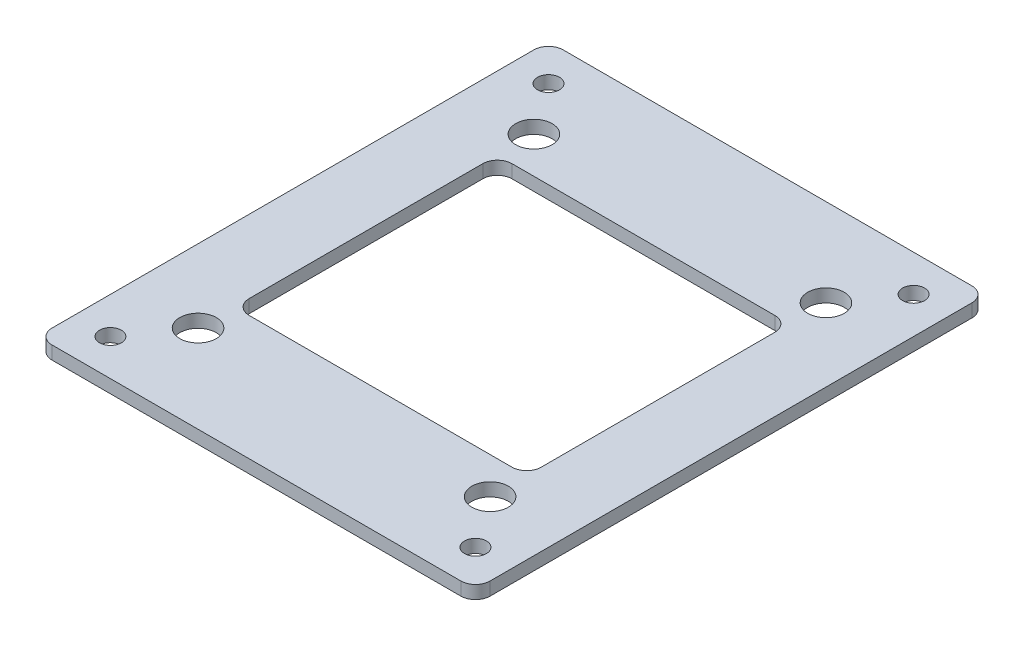
ISO-10303-21;
HEADER;
FILE_DESCRIPTION(('STEP AP214'),'2;1');
FILE_NAME('part.step','',(''),(''),'','','');
FILE_SCHEMA(('AUTOMOTIVE_DESIGN { 1 0 10303 214 1 1 1 1 }'));
ENDSEC;
DATA;
#1=APPLICATION_CONTEXT('core data for automotive mechanical design processes');
#2=APPLICATION_PROTOCOL_DEFINITION('international standard','automotive_design',2000,#1);
#3=PRODUCT_CONTEXT('',#1,'mechanical');
#4=PRODUCT('Part','Part','',(#3));
#5=PRODUCT_RELATED_PRODUCT_CATEGORY('part','',(#4));
#6=PRODUCT_DEFINITION_FORMATION('','',#4);
#7=PRODUCT_DEFINITION_CONTEXT('part definition',#1,'design');
#8=PRODUCT_DEFINITION('design','',#6,#7);
#9=PRODUCT_DEFINITION_SHAPE('','',#8);
#10=(LENGTH_UNIT() NAMED_UNIT(*) SI_UNIT(.MILLI.,.METRE.));
#11=(NAMED_UNIT(*) PLANE_ANGLE_UNIT() SI_UNIT($,.RADIAN.));
#12=(NAMED_UNIT(*) SI_UNIT($,.STERADIAN.) SOLID_ANGLE_UNIT());
#13=UNCERTAINTY_MEASURE_WITH_UNIT(LENGTH_MEASURE(1.E-05),#10,'distance_accuracy_value','');
#14=(GEOMETRIC_REPRESENTATION_CONTEXT(3) GLOBAL_UNCERTAINTY_ASSIGNED_CONTEXT((#13)) GLOBAL_UNIT_ASSIGNED_CONTEXT((#10,
#11,#12)) REPRESENTATION_CONTEXT('',''));
#15=CARTESIAN_POINT('',(0.,0.,0.));
#16=DIRECTION('',(0.,0.,1.));
#17=DIRECTION('',(1.,0.,0.));
#18=AXIS2_PLACEMENT_3D('',#15,#16,#17);
#19=CARTESIAN_POINT('',(0.,1.8,0.));
#20=DIRECTION('',(0.,-1.,0.));
#21=DIRECTION('',(0.,0.,-1.));
#22=AXIS2_PLACEMENT_3D('',#19,#20,#21);
#23=PLANE('',#22);
#24=DIRECTION('',(-1.,0.,0.));
#25=VECTOR('',#24,1.);
#26=CARTESIAN_POINT('',(-20.,1.8,-18.));
#27=LINE('',#26,#25);
#28=CARTESIAN_POINT('',(18.,1.8,-18.));
#29=VERTEX_POINT('',#28);
#30=CARTESIAN_POINT('',(-18.,1.8,-18.));
#31=VERTEX_POINT('',#30);
#32=EDGE_CURVE('E172',#29,#31,#27,.T.);
#33=ORIENTED_EDGE('',*,*,#32,.F.);
#34=CARTESIAN_POINT('',(18.,1.8,-16.));
#35=DIRECTION('',(0.,-1.,0.));
#36=DIRECTION('',(0.,0.,-1.));
#37=AXIS2_PLACEMENT_3D('',#34,#35,#36);
#38=CIRCLE('',#37,2.);
#39=CARTESIAN_POINT('',(20.,1.8,-16.));
#40=VERTEX_POINT('',#39);
#41=EDGE_CURVE('E154',#29,#40,#38,.T.);
#42=ORIENTED_EDGE('',*,*,#41,.T.);
#43=DIRECTION('',(0.,0.,-1.));
#44=VECTOR('',#43,1.);
#45=CARTESIAN_POINT('',(20.,1.8,18.));
#46=LINE('',#45,#44);
#47=CARTESIAN_POINT('',(20.,1.8,16.));
#48=VERTEX_POINT('',#47);
#49=EDGE_CURVE('E185',#48,#40,#46,.T.);
#50=ORIENTED_EDGE('',*,*,#49,.F.);
#51=CARTESIAN_POINT('',(18.,1.8,16.));
#52=DIRECTION('',(0.,-1.,0.));
#53=DIRECTION('',(0.,0.,-1.));
#54=AXIS2_PLACEMENT_3D('',#51,#52,#53);
#55=CIRCLE('',#54,2.);
#56=CARTESIAN_POINT('',(18.,1.8,18.));
#57=VERTEX_POINT('',#56);
#58=EDGE_CURVE('E346',#48,#57,#55,.T.);
#59=ORIENTED_EDGE('',*,*,#58,.T.);
#60=DIRECTION('',(1.,0.,0.));
#61=VECTOR('',#60,1.);
#62=CARTESIAN_POINT('',(-20.,1.8,18.));
#63=LINE('',#62,#61);
#64=CARTESIAN_POINT('',(-18.,1.8,18.));
#65=VERTEX_POINT('',#64);
#66=EDGE_CURVE('E190',#65,#57,#63,.T.);
#67=ORIENTED_EDGE('',*,*,#66,.F.);
#68=CARTESIAN_POINT('',(-18.,1.8,16.));
#69=DIRECTION('',(0.,-1.,0.));
#70=DIRECTION('',(0.,0.,-1.));
#71=AXIS2_PLACEMENT_3D('',#68,#69,#70);
#72=CIRCLE('',#71,2.);
#73=CARTESIAN_POINT('',(-20.,1.8,16.));
#74=VERTEX_POINT('',#73);
#75=EDGE_CURVE('E48',#65,#74,#72,.T.);
#76=ORIENTED_EDGE('',*,*,#75,.T.);
#77=DIRECTION('',(0.,0.,1.));
#78=VECTOR('',#77,1.);
#79=CARTESIAN_POINT('',(-20.,1.8,18.));
#80=LINE('',#79,#78);
#81=CARTESIAN_POINT('',(-20.,1.8,-16.));
#82=VERTEX_POINT('',#81);
#83=EDGE_CURVE('E184',#82,#74,#80,.T.);
#84=ORIENTED_EDGE('',*,*,#83,.F.);
#85=CARTESIAN_POINT('',(-18.,1.8,-16.));
#86=DIRECTION('',(0.,-1.,0.));
#87=DIRECTION('',(0.,0.,-1.));
#88=AXIS2_PLACEMENT_3D('',#85,#86,#87);
#89=CIRCLE('',#88,2.);
#90=EDGE_CURVE('E182',#82,#31,#89,.T.);
#91=ORIENTED_EDGE('',*,*,#90,.T.);
#92=EDGE_LOOP('',(#33,#42,#50,#59,#67,#76,#84,#91));
#93=FACE_BOUND('',#92,.T.);
#94=CARTESIAN_POINT('',(-25.,1.8,30.));
#95=DIRECTION('',(0.,1.,0.));
#96=DIRECTION('',(0.,0.,-1.));
#97=AXIS2_PLACEMENT_3D('',#94,#95,#96);
#98=CIRCLE('',#97,1.5);
#99=CARTESIAN_POINT('',(-25.,1.8,28.5));
#100=VERTEX_POINT('',#99);
#101=EDGE_CURVE('E375',#100,#100,#98,.T.);
#102=ORIENTED_EDGE('',*,*,#101,.F.);
#103=EDGE_LOOP('',(#102));
#104=FACE_BOUND('',#103,.T.);
#105=CARTESIAN_POINT('',(24.9999999999998,1.8,30.));
#106=DIRECTION('',(0.,1.,0.));
#107=DIRECTION('',(0.,0.,1.));
#108=AXIS2_PLACEMENT_3D('',#105,#106,#107);
#109=CIRCLE('',#108,1.50000000000001);
#110=CARTESIAN_POINT('',(24.9999999999998,1.8,31.5));
#111=VERTEX_POINT('',#110);
#112=EDGE_CURVE('E391',#111,#111,#109,.T.);
#113=ORIENTED_EDGE('',*,*,#112,.F.);
#114=EDGE_LOOP('',(#113));
#115=FACE_BOUND('',#114,.T.);
#116=CARTESIAN_POINT('',(24.9999999999998,1.8,-30.));
#117=DIRECTION('',(0.,1.,0.));
#118=DIRECTION('',(0.,0.,-1.));
#119=AXIS2_PLACEMENT_3D('',#116,#117,#118);
#120=CIRCLE('',#119,1.50000000000001);
#121=CARTESIAN_POINT('',(24.9999999999998,1.8,-31.5));
#122=VERTEX_POINT('',#121);
#123=EDGE_CURVE('E399',#122,#122,#120,.T.);
#124=ORIENTED_EDGE('',*,*,#123,.F.);
#125=EDGE_LOOP('',(#124));
#126=FACE_BOUND('',#125,.T.);
#127=CARTESIAN_POINT('',(-25.,1.8,-30.));
#128=DIRECTION('',(0.,1.,0.));
#129=DIRECTION('',(0.,0.,1.));
#130=AXIS2_PLACEMENT_3D('',#127,#128,#129);
#131=CIRCLE('',#130,1.5);
#132=CARTESIAN_POINT('',(-25.,1.8,-28.5));
#133=VERTEX_POINT('',#132);
#134=EDGE_CURVE('E204',#133,#133,#131,.T.);
#135=ORIENTED_EDGE('',*,*,#134,.F.);
#136=EDGE_LOOP('',(#135));
#137=FACE_BOUND('',#136,.T.);
#138=DIRECTION('',(0.,0.,1.));
#139=VECTOR('',#138,1.);
#140=CARTESIAN_POINT('',(-30.,1.8,35.));
#141=LINE('',#140,#139);
#142=CARTESIAN_POINT('',(-30.,1.8,-33.));
#143=VERTEX_POINT('',#142);
#144=CARTESIAN_POINT('',(-30.,1.8,33.));
#145=VERTEX_POINT('',#144);
#146=EDGE_CURVE('E248',#143,#145,#141,.T.);
#147=ORIENTED_EDGE('',*,*,#146,.T.);
#148=CARTESIAN_POINT('',(-28.,1.8,33.));
#149=DIRECTION('',(0.,-1.,0.));
#150=DIRECTION('',(0.,0.,-1.));
#151=AXIS2_PLACEMENT_3D('',#148,#149,#150);
#152=CIRCLE('',#151,2.);
#153=CARTESIAN_POINT('',(-28.,1.8,35.));
#154=VERTEX_POINT('',#153);
#155=EDGE_CURVE('E324',#145,#154,#152,.F.);
#156=ORIENTED_EDGE('',*,*,#155,.T.);
#157=DIRECTION('',(1.,0.,0.));
#158=VECTOR('',#157,1.);
#159=CARTESIAN_POINT('',(-30.,1.8,35.));
#160=LINE('',#159,#158);
#161=CARTESIAN_POINT('',(28.,1.8,35.));
#162=VERTEX_POINT('',#161);
#163=EDGE_CURVE('E252',#154,#162,#160,.T.);
#164=ORIENTED_EDGE('',*,*,#163,.T.);
#165=CARTESIAN_POINT('',(28.,1.8,33.));
#166=DIRECTION('',(0.,-1.,0.));
#167=DIRECTION('',(0.,0.,-1.));
#168=AXIS2_PLACEMENT_3D('',#165,#166,#167);
#169=CIRCLE('',#168,2.);
#170=CARTESIAN_POINT('',(30.,1.8,33.));
#171=VERTEX_POINT('',#170);
#172=EDGE_CURVE('E321',#162,#171,#169,.F.);
#173=ORIENTED_EDGE('',*,*,#172,.T.);
#174=DIRECTION('',(0.,0.,-1.));
#175=VECTOR('',#174,1.);
#176=CARTESIAN_POINT('',(30.,1.8,35.));
#177=LINE('',#176,#175);
#178=CARTESIAN_POINT('',(30.,1.8,-33.));
#179=VERTEX_POINT('',#178);
#180=EDGE_CURVE('E241',#171,#179,#177,.T.);
#181=ORIENTED_EDGE('',*,*,#180,.T.);
#182=CARTESIAN_POINT('',(28.,1.8,-33.));
#183=DIRECTION('',(0.,-1.,0.));
#184=DIRECTION('',(0.,0.,-1.));
#185=AXIS2_PLACEMENT_3D('',#182,#183,#184);
#186=CIRCLE('',#185,2.);
#187=CARTESIAN_POINT('',(28.,1.8,-35.));
#188=VERTEX_POINT('',#187);
#189=EDGE_CURVE('E62',#179,#188,#186,.F.);
#190=ORIENTED_EDGE('',*,*,#189,.T.);
#191=DIRECTION('',(-1.,0.,0.));
#192=VECTOR('',#191,1.);
#193=CARTESIAN_POINT('',(-30.,1.8,-35.));
#194=LINE('',#193,#192);
#195=CARTESIAN_POINT('',(-28.,1.8,-35.));
#196=VERTEX_POINT('',#195);
#197=EDGE_CURVE('E244',#188,#196,#194,.T.);
#198=ORIENTED_EDGE('',*,*,#197,.T.);
#199=CARTESIAN_POINT('',(-28.,1.8,-33.));
#200=DIRECTION('',(0.,-1.,0.));
#201=DIRECTION('',(0.,0.,-1.));
#202=AXIS2_PLACEMENT_3D('',#199,#200,#201);
#203=CIRCLE('',#202,2.);
#204=EDGE_CURVE('E316',#196,#143,#203,.F.);
#205=ORIENTED_EDGE('',*,*,#204,.T.);
#206=EDGE_LOOP('',(#147,#156,#164,#173,#181,#190,#198,#205));
#207=FACE_BOUND('',#206,.T.);
#208=CARTESIAN_POINT('',(-20.,1.8,-23.));
#209=DIRECTION('',(0.,1.,0.));
#210=DIRECTION('',(0.,0.,1.));
#211=AXIS2_PLACEMENT_3D('',#208,#209,#210);
#212=CIRCLE('',#211,2.5);
#213=CARTESIAN_POINT('',(-20.,1.8,-20.5));
#214=VERTEX_POINT('',#213);
#215=EDGE_CURVE('E233',#214,#214,#212,.T.);
#216=ORIENTED_EDGE('',*,*,#215,.F.);
#217=EDGE_LOOP('',(#216));
#218=FACE_BOUND('',#217,.T.);
#219=CARTESIAN_POINT('',(20.,1.8,-23.));
#220=DIRECTION('',(0.,1.,0.));
#221=DIRECTION('',(0.,0.,-1.));
#222=AXIS2_PLACEMENT_3D('',#219,#220,#221);
#223=CIRCLE('',#222,2.5);
#224=CARTESIAN_POINT('',(20.,1.8,-25.5));
#225=VERTEX_POINT('',#224);
#226=EDGE_CURVE('E225',#225,#225,#223,.T.);
#227=ORIENTED_EDGE('',*,*,#226,.F.);
#228=EDGE_LOOP('',(#227));
#229=FACE_BOUND('',#228,.T.);
#230=CARTESIAN_POINT('',(20.,1.8,23.));
#231=DIRECTION('',(0.,1.,0.));
#232=DIRECTION('',(0.,0.,1.));
#233=AXIS2_PLACEMENT_3D('',#230,#231,#232);
#234=CIRCLE('',#233,2.5);
#235=CARTESIAN_POINT('',(20.,1.8,25.5));
#236=VERTEX_POINT('',#235);
#237=EDGE_CURVE('E217',#236,#236,#234,.T.);
#238=ORIENTED_EDGE('',*,*,#237,.F.);
#239=EDGE_LOOP('',(#238));
#240=FACE_BOUND('',#239,.T.);
#241=CARTESIAN_POINT('',(-20.,1.8,23.));
#242=DIRECTION('',(0.,1.,0.));
#243=DIRECTION('',(0.,0.,-1.));
#244=AXIS2_PLACEMENT_3D('',#241,#242,#243);
#245=CIRCLE('',#244,2.5);
#246=CARTESIAN_POINT('',(-20.,1.8,20.5));
#247=VERTEX_POINT('',#246);
#248=EDGE_CURVE('E209',#247,#247,#245,.T.);
#249=ORIENTED_EDGE('',*,*,#248,.F.);
#250=EDGE_LOOP('',(#249));
#251=FACE_BOUND('',#250,.T.);
#252=ADVANCED_FACE('F39',(#93,#104,#115,#126,#137,#207,#218,#229,#240,#251),#23,.F.);
#253=CARTESIAN_POINT('',(0.,0.,0.));
#254=DIRECTION('',(0.,-1.,0.));
#255=DIRECTION('',(0.,0.,-1.));
#256=AXIS2_PLACEMENT_3D('',#253,#254,#255);
#257=PLANE('',#256);
#258=DIRECTION('',(1.,0.,0.));
#259=VECTOR('',#258,1.);
#260=CARTESIAN_POINT('',(-20.,0.,18.));
#261=LINE('',#260,#259);
#262=CARTESIAN_POINT('',(-18.,0.,18.));
#263=VERTEX_POINT('',#262);
#264=CARTESIAN_POINT('',(18.,0.,18.));
#265=VERTEX_POINT('',#264);
#266=EDGE_CURVE('E368',#263,#265,#261,.T.);
#267=ORIENTED_EDGE('',*,*,#266,.T.);
#268=CARTESIAN_POINT('',(18.,0.,16.));
#269=DIRECTION('',(0.,-1.,0.));
#270=DIRECTION('',(0.,0.,-1.));
#271=AXIS2_PLACEMENT_3D('',#268,#269,#270);
#272=CIRCLE('',#271,2.);
#273=CARTESIAN_POINT('',(20.,0.,16.));
#274=VERTEX_POINT('',#273);
#275=EDGE_CURVE('E349',#265,#274,#272,.F.);
#276=ORIENTED_EDGE('',*,*,#275,.T.);
#277=DIRECTION('',(0.,0.,-1.));
#278=VECTOR('',#277,1.);
#279=CARTESIAN_POINT('',(20.,0.,18.));
#280=LINE('',#279,#278);
#281=CARTESIAN_POINT('',(20.,0.,-16.));
#282=VERTEX_POINT('',#281);
#283=EDGE_CURVE('E198',#274,#282,#280,.T.);
#284=ORIENTED_EDGE('',*,*,#283,.T.);
#285=CARTESIAN_POINT('',(18.,0.,-16.));
#286=DIRECTION('',(0.,-1.,0.));
#287=DIRECTION('',(0.,0.,-1.));
#288=AXIS2_PLACEMENT_3D('',#285,#286,#287);
#289=CIRCLE('',#288,2.);
#290=CARTESIAN_POINT('',(18.,0.,-18.));
#291=VERTEX_POINT('',#290);
#292=EDGE_CURVE('E165',#282,#291,#289,.F.);
#293=ORIENTED_EDGE('',*,*,#292,.T.);
#294=DIRECTION('',(-1.,0.,0.));
#295=VECTOR('',#294,1.);
#296=CARTESIAN_POINT('',(-20.,0.,-18.));
#297=LINE('',#296,#295);
#298=CARTESIAN_POINT('',(-18.,0.,-18.));
#299=VERTEX_POINT('',#298);
#300=EDGE_CURVE('E175',#291,#299,#297,.T.);
#301=ORIENTED_EDGE('',*,*,#300,.T.);
#302=CARTESIAN_POINT('',(-18.,0.,-16.));
#303=DIRECTION('',(0.,-1.,0.));
#304=DIRECTION('',(0.,0.,-1.));
#305=AXIS2_PLACEMENT_3D('',#302,#303,#304);
#306=CIRCLE('',#305,2.);
#307=CARTESIAN_POINT('',(-20.,0.,-16.));
#308=VERTEX_POINT('',#307);
#309=EDGE_CURVE('E343',#299,#308,#306,.F.);
#310=ORIENTED_EDGE('',*,*,#309,.T.);
#311=DIRECTION('',(0.,0.,1.));
#312=VECTOR('',#311,1.);
#313=CARTESIAN_POINT('',(-20.,0.,18.));
#314=LINE('',#313,#312);
#315=CARTESIAN_POINT('',(-20.,0.,16.));
#316=VERTEX_POINT('',#315);
#317=EDGE_CURVE('E370',#308,#316,#314,.T.);
#318=ORIENTED_EDGE('',*,*,#317,.T.);
#319=CARTESIAN_POINT('',(-18.,0.,16.));
#320=DIRECTION('',(0.,-1.,0.));
#321=DIRECTION('',(0.,0.,-1.));
#322=AXIS2_PLACEMENT_3D('',#319,#320,#321);
#323=CIRCLE('',#322,2.);
#324=EDGE_CURVE('E11',#316,#263,#323,.F.);
#325=ORIENTED_EDGE('',*,*,#324,.T.);
#326=EDGE_LOOP('',(#267,#276,#284,#293,#301,#310,#318,#325));
#327=FACE_BOUND('',#326,.T.);
#328=CARTESIAN_POINT('',(-25.,0.,30.));
#329=DIRECTION('',(0.,1.,0.));
#330=DIRECTION('',(0.,0.,-1.));
#331=AXIS2_PLACEMENT_3D('',#328,#329,#330);
#332=CIRCLE('',#331,1.5);
#333=CARTESIAN_POINT('',(-25.,0.,28.5));
#334=VERTEX_POINT('',#333);
#335=EDGE_CURVE('E379',#334,#334,#332,.T.);
#336=ORIENTED_EDGE('',*,*,#335,.T.);
#337=EDGE_LOOP('',(#336));
#338=FACE_BOUND('',#337,.T.);
#339=CARTESIAN_POINT('',(24.9999999999998,0.,30.));
#340=DIRECTION('',(0.,1.,0.));
#341=DIRECTION('',(0.,0.,1.));
#342=AXIS2_PLACEMENT_3D('',#339,#340,#341);
#343=CIRCLE('',#342,1.50000000000001);
#344=CARTESIAN_POINT('',(24.9999999999998,0.,31.5));
#345=VERTEX_POINT('',#344);
#346=EDGE_CURVE('E395',#345,#345,#343,.T.);
#347=ORIENTED_EDGE('',*,*,#346,.T.);
#348=EDGE_LOOP('',(#347));
#349=FACE_BOUND('',#348,.T.);
#350=CARTESIAN_POINT('',(24.9999999999998,0.,-30.));
#351=DIRECTION('',(0.,1.,0.));
#352=DIRECTION('',(0.,0.,-1.));
#353=AXIS2_PLACEMENT_3D('',#350,#351,#352);
#354=CIRCLE('',#353,1.50000000000001);
#355=CARTESIAN_POINT('',(24.9999999999998,0.,-31.5));
#356=VERTEX_POINT('',#355);
#357=EDGE_CURVE('E208',#356,#356,#354,.T.);
#358=ORIENTED_EDGE('',*,*,#357,.T.);
#359=EDGE_LOOP('',(#358));
#360=FACE_BOUND('',#359,.T.);
#361=CARTESIAN_POINT('',(-25.,0.,-30.));
#362=DIRECTION('',(0.,1.,0.));
#363=DIRECTION('',(0.,0.,1.));
#364=AXIS2_PLACEMENT_3D('',#361,#362,#363);
#365=CIRCLE('',#364,1.5);
#366=CARTESIAN_POINT('',(-25.,0.,-28.5));
#367=VERTEX_POINT('',#366);
#368=EDGE_CURVE('E199',#367,#367,#365,.T.);
#369=ORIENTED_EDGE('',*,*,#368,.T.);
#370=EDGE_LOOP('',(#369));
#371=FACE_BOUND('',#370,.T.);
#372=CARTESIAN_POINT('',(20.,0.,23.));
#373=DIRECTION('',(0.,1.,0.));
#374=DIRECTION('',(0.,0.,1.));
#375=AXIS2_PLACEMENT_3D('',#372,#373,#374);
#376=CIRCLE('',#375,2.5);
#377=CARTESIAN_POINT('',(20.,0.,25.5));
#378=VERTEX_POINT('',#377);
#379=EDGE_CURVE('E213',#378,#378,#376,.T.);
#380=ORIENTED_EDGE('',*,*,#379,.T.);
#381=EDGE_LOOP('',(#380));
#382=FACE_BOUND('',#381,.T.);
#383=CARTESIAN_POINT('',(-20.,0.,-23.));
#384=DIRECTION('',(0.,1.,0.));
#385=DIRECTION('',(0.,0.,1.));
#386=AXIS2_PLACEMENT_3D('',#383,#384,#385);
#387=CIRCLE('',#386,2.5);
#388=CARTESIAN_POINT('',(-20.,0.,-20.5));
#389=VERTEX_POINT('',#388);
#390=EDGE_CURVE('E229',#389,#389,#387,.T.);
#391=ORIENTED_EDGE('',*,*,#390,.T.);
#392=EDGE_LOOP('',(#391));
#393=FACE_BOUND('',#392,.T.);
#394=DIRECTION('',(1.,0.,0.));
#395=VECTOR('',#394,1.);
#396=CARTESIAN_POINT('',(-30.,0.,35.));
#397=LINE('',#396,#395);
#398=CARTESIAN_POINT('',(-28.,0.,35.));
#399=VERTEX_POINT('',#398);
#400=CARTESIAN_POINT('',(28.,0.,35.));
#401=VERTEX_POINT('',#400);
#402=EDGE_CURVE('E245',#399,#401,#397,.T.);
#403=ORIENTED_EDGE('',*,*,#402,.F.);
#404=CARTESIAN_POINT('',(-28.,0.,33.));
#405=DIRECTION('',(0.,-1.,0.));
#406=DIRECTION('',(0.,0.,-1.));
#407=AXIS2_PLACEMENT_3D('',#404,#405,#406);
#408=CIRCLE('',#407,2.);
#409=CARTESIAN_POINT('',(-30.,0.,33.));
#410=VERTEX_POINT('',#409);
#411=EDGE_CURVE('E306',#399,#410,#408,.T.);
#412=ORIENTED_EDGE('',*,*,#411,.T.);
#413=DIRECTION('',(0.,0.,1.));
#414=VECTOR('',#413,1.);
#415=CARTESIAN_POINT('',(-30.,0.,35.));
#416=LINE('',#415,#414);
#417=CARTESIAN_POINT('',(-30.,0.,-33.));
#418=VERTEX_POINT('',#417);
#419=EDGE_CURVE('E262',#418,#410,#416,.T.);
#420=ORIENTED_EDGE('',*,*,#419,.F.);
#421=CARTESIAN_POINT('',(-28.,0.,-33.));
#422=DIRECTION('',(0.,-1.,0.));
#423=DIRECTION('',(0.,0.,-1.));
#424=AXIS2_PLACEMENT_3D('',#421,#422,#423);
#425=CIRCLE('',#424,2.);
#426=CARTESIAN_POINT('',(-28.,0.,-35.));
#427=VERTEX_POINT('',#426);
#428=EDGE_CURVE('E297',#418,#427,#425,.T.);
#429=ORIENTED_EDGE('',*,*,#428,.T.);
#430=DIRECTION('',(-1.,0.,0.));
#431=VECTOR('',#430,1.);
#432=CARTESIAN_POINT('',(-30.,0.,-35.));
#433=LINE('',#432,#431);
#434=CARTESIAN_POINT('',(28.,0.,-35.));
#435=VERTEX_POINT('',#434);
#436=EDGE_CURVE('E259',#435,#427,#433,.T.);
#437=ORIENTED_EDGE('',*,*,#436,.F.);
#438=CARTESIAN_POINT('',(28.,0.,-33.));
#439=DIRECTION('',(0.,-1.,0.));
#440=DIRECTION('',(0.,0.,-1.));
#441=AXIS2_PLACEMENT_3D('',#438,#439,#440);
#442=CIRCLE('',#441,2.);
#443=CARTESIAN_POINT('',(30.,0.,-33.));
#444=VERTEX_POINT('',#443);
#445=EDGE_CURVE('E300',#435,#444,#442,.T.);
#446=ORIENTED_EDGE('',*,*,#445,.T.);
#447=DIRECTION('',(0.,0.,-1.));
#448=VECTOR('',#447,1.);
#449=CARTESIAN_POINT('',(30.,0.,35.));
#450=LINE('',#449,#448);
#451=CARTESIAN_POINT('',(30.,0.,33.));
#452=VERTEX_POINT('',#451);
#453=EDGE_CURVE('E237',#452,#444,#450,.T.);
#454=ORIENTED_EDGE('',*,*,#453,.F.);
#455=CARTESIAN_POINT('',(28.,0.,33.));
#456=DIRECTION('',(0.,-1.,0.));
#457=DIRECTION('',(0.,0.,-1.));
#458=AXIS2_PLACEMENT_3D('',#455,#456,#457);
#459=CIRCLE('',#458,2.);
#460=EDGE_CURVE('E303',#452,#401,#459,.T.);
#461=ORIENTED_EDGE('',*,*,#460,.T.);
#462=EDGE_LOOP('',(#403,#412,#420,#429,#437,#446,#454,#461));
#463=FACE_BOUND('',#462,.T.);
#464=CARTESIAN_POINT('',(20.,0.,-23.));
#465=DIRECTION('',(0.,1.,0.));
#466=DIRECTION('',(0.,0.,-1.));
#467=AXIS2_PLACEMENT_3D('',#464,#465,#466);
#468=CIRCLE('',#467,2.5);
#469=CARTESIAN_POINT('',(20.,0.,-25.5));
#470=VERTEX_POINT('',#469);
#471=EDGE_CURVE('E221',#470,#470,#468,.T.);
#472=ORIENTED_EDGE('',*,*,#471,.T.);
#473=EDGE_LOOP('',(#472));
#474=FACE_BOUND('',#473,.T.);
#475=CARTESIAN_POINT('',(-20.,0.,23.));
#476=DIRECTION('',(0.,1.,0.));
#477=DIRECTION('',(0.,0.,-1.));
#478=AXIS2_PLACEMENT_3D('',#475,#476,#477);
#479=CIRCLE('',#478,2.5);
#480=CARTESIAN_POINT('',(-20.,0.,20.5));
#481=VERTEX_POINT('',#480);
#482=EDGE_CURVE('E203',#481,#481,#479,.T.);
#483=ORIENTED_EDGE('',*,*,#482,.T.);
#484=EDGE_LOOP('',(#483));
#485=FACE_BOUND('',#484,.T.);
#486=ADVANCED_FACE('F366',(#327,#338,#349,#360,#371,#382,#393,#463,#474,#485),#257,.T.);
#487=CARTESIAN_POINT('',(30.,1.8,35.));
#488=DIRECTION('',(-1.,0.,0.));
#489=DIRECTION('',(0.,0.,1.));
#490=AXIS2_PLACEMENT_3D('',#487,#488,#489);
#491=PLANE('',#490);
#492=ORIENTED_EDGE('',*,*,#180,.F.);
#493=DIRECTION('',(0.,-1.,0.));
#494=VECTOR('',#493,1.);
#495=CARTESIAN_POINT('',(30.,1.8,33.));
#496=LINE('',#495,#494);
#497=EDGE_CURVE('E330',#171,#452,#496,.T.);
#498=ORIENTED_EDGE('',*,*,#497,.T.);
#499=ORIENTED_EDGE('',*,*,#453,.T.);
#500=DIRECTION('',(0.,-1.,0.));
#501=VECTOR('',#500,1.);
#502=CARTESIAN_POINT('',(30.,1.8,-33.));
#503=LINE('',#502,#501);
#504=EDGE_CURVE('E327',#444,#179,#503,.F.);
#505=ORIENTED_EDGE('',*,*,#504,.T.);
#506=EDGE_LOOP('',(#492,#498,#499,#505));
#507=FACE_BOUND('',#506,.T.);
#508=ADVANCED_FACE('F440',(#507),#491,.F.);
#509=CARTESIAN_POINT('',(-30.,1.8,-35.));
#510=DIRECTION('',(0.,0.,1.));
#511=DIRECTION('',(1.,0.,0.));
#512=AXIS2_PLACEMENT_3D('',#509,#510,#511);
#513=PLANE('',#512);
#514=ORIENTED_EDGE('',*,*,#197,.F.);
#515=DIRECTION('',(0.,-1.,0.));
#516=VECTOR('',#515,1.);
#517=CARTESIAN_POINT('',(28.,1.8,-35.));
#518=LINE('',#517,#516);
#519=EDGE_CURVE('E166',#188,#435,#518,.T.);
#520=ORIENTED_EDGE('',*,*,#519,.T.);
#521=ORIENTED_EDGE('',*,*,#436,.T.);
#522=DIRECTION('',(0.,-1.,0.));
#523=VECTOR('',#522,1.);
#524=CARTESIAN_POINT('',(-28.,1.8,-35.));
#525=LINE('',#524,#523);
#526=EDGE_CURVE('E55',#427,#196,#525,.F.);
#527=ORIENTED_EDGE('',*,*,#526,.T.);
#528=EDGE_LOOP('',(#514,#520,#521,#527));
#529=FACE_BOUND('',#528,.T.);
#530=ADVANCED_FACE('F445',(#529),#513,.F.);
#531=CARTESIAN_POINT('',(-30.,1.8,35.));
#532=DIRECTION('',(1.,0.,0.));
#533=DIRECTION('',(0.,0.,-1.));
#534=AXIS2_PLACEMENT_3D('',#531,#532,#533);
#535=PLANE('',#534);
#536=ORIENTED_EDGE('',*,*,#419,.T.);
#537=DIRECTION('',(0.,-1.,0.));
#538=VECTOR('',#537,1.);
#539=CARTESIAN_POINT('',(-30.,1.8,33.));
#540=LINE('',#539,#538);
#541=EDGE_CURVE('E313',#410,#145,#540,.F.);
#542=ORIENTED_EDGE('',*,*,#541,.T.);
#543=ORIENTED_EDGE('',*,*,#146,.F.);
#544=DIRECTION('',(0.,-1.,0.));
#545=VECTOR('',#544,1.);
#546=CARTESIAN_POINT('',(-30.,1.8,-33.));
#547=LINE('',#546,#545);
#548=EDGE_CURVE('E309',#143,#418,#547,.T.);
#549=ORIENTED_EDGE('',*,*,#548,.T.);
#550=EDGE_LOOP('',(#536,#542,#543,#549));
#551=FACE_BOUND('',#550,.T.);
#552=ADVANCED_FACE('F454',(#551),#535,.F.);
#553=CARTESIAN_POINT('',(-30.,1.8,35.));
#554=DIRECTION('',(0.,0.,-1.));
#555=DIRECTION('',(-1.,0.,0.));
#556=AXIS2_PLACEMENT_3D('',#553,#554,#555);
#557=PLANE('',#556);
#558=ORIENTED_EDGE('',*,*,#163,.F.);
#559=DIRECTION('',(0.,-1.,0.));
#560=VECTOR('',#559,1.);
#561=CARTESIAN_POINT('',(-28.,1.8,35.));
#562=LINE('',#561,#560);
#563=EDGE_CURVE('E293',#154,#399,#562,.T.);
#564=ORIENTED_EDGE('',*,*,#563,.T.);
#565=ORIENTED_EDGE('',*,*,#402,.T.);
#566=DIRECTION('',(0.,-1.,0.));
#567=VECTOR('',#566,1.);
#568=CARTESIAN_POINT('',(28.,1.8,35.));
#569=LINE('',#568,#567);
#570=EDGE_CURVE('E290',#401,#162,#569,.F.);
#571=ORIENTED_EDGE('',*,*,#570,.T.);
#572=EDGE_LOOP('',(#558,#564,#565,#571));
#573=FACE_BOUND('',#572,.T.);
#574=ADVANCED_FACE('F450',(#573),#557,.F.);
#575=CARTESIAN_POINT('',(-20.,1.8,-23.));
#576=DIRECTION('',(0.,-1.,0.));
#577=DIRECTION('',(0.,0.,-1.));
#578=AXIS2_PLACEMENT_3D('',#575,#576,#577);
#579=CYLINDRICAL_SURFACE('',#578,2.5);
#580=ORIENTED_EDGE('',*,*,#215,.T.);
#581=EDGE_LOOP('',(#580));
#582=FACE_BOUND('',#581,.T.);
#583=ORIENTED_EDGE('',*,*,#390,.F.);
#584=EDGE_LOOP('',(#583));
#585=FACE_BOUND('',#584,.T.);
#586=ADVANCED_FACE('F453',(#582,#585),#579,.F.);
#587=CARTESIAN_POINT('',(20.,1.8,-23.));
#588=DIRECTION('',(0.,-1.,0.));
#589=DIRECTION('',(0.,0.,-1.));
#590=AXIS2_PLACEMENT_3D('',#587,#588,#589);
#591=CYLINDRICAL_SURFACE('',#590,2.5);
#592=ORIENTED_EDGE('',*,*,#226,.T.);
#593=EDGE_LOOP('',(#592));
#594=FACE_BOUND('',#593,.T.);
#595=ORIENTED_EDGE('',*,*,#471,.F.);
#596=EDGE_LOOP('',(#595));
#597=FACE_BOUND('',#596,.T.);
#598=ADVANCED_FACE('F506',(#594,#597),#591,.F.);
#599=CARTESIAN_POINT('',(20.,1.8,23.));
#600=DIRECTION('',(0.,-1.,0.));
#601=DIRECTION('',(0.,0.,-1.));
#602=AXIS2_PLACEMENT_3D('',#599,#600,#601);
#603=CYLINDRICAL_SURFACE('',#602,2.5);
#604=ORIENTED_EDGE('',*,*,#237,.T.);
#605=EDGE_LOOP('',(#604));
#606=FACE_BOUND('',#605,.T.);
#607=ORIENTED_EDGE('',*,*,#379,.F.);
#608=EDGE_LOOP('',(#607));
#609=FACE_BOUND('',#608,.T.);
#610=ADVANCED_FACE('F435',(#606,#609),#603,.F.);
#611=CARTESIAN_POINT('',(-20.,1.8,23.));
#612=DIRECTION('',(0.,-1.,0.));
#613=DIRECTION('',(0.,0.,-1.));
#614=AXIS2_PLACEMENT_3D('',#611,#612,#613);
#615=CYLINDRICAL_SURFACE('',#614,2.5);
#616=ORIENTED_EDGE('',*,*,#248,.T.);
#617=EDGE_LOOP('',(#616));
#618=FACE_BOUND('',#617,.T.);
#619=ORIENTED_EDGE('',*,*,#482,.F.);
#620=EDGE_LOOP('',(#619));
#621=FACE_BOUND('',#620,.T.);
#622=ADVANCED_FACE('F432',(#618,#621),#615,.F.);
#623=CARTESIAN_POINT('',(-25.,0.,-30.));
#624=DIRECTION('',(0.,1.,0.));
#625=DIRECTION('',(0.,0.,1.));
#626=AXIS2_PLACEMENT_3D('',#623,#624,#625);
#627=CYLINDRICAL_SURFACE('',#626,1.5);
#628=ORIENTED_EDGE('',*,*,#368,.F.);
#629=EDGE_LOOP('',(#628));
#630=FACE_BOUND('',#629,.T.);
#631=ORIENTED_EDGE('',*,*,#134,.T.);
#632=EDGE_LOOP('',(#631));
#633=FACE_BOUND('',#632,.T.);
#634=ADVANCED_FACE('F413',(#630,#633),#627,.F.);
#635=CARTESIAN_POINT('',(24.9999999999998,0.,-30.));
#636=DIRECTION('',(0.,1.,0.));
#637=DIRECTION('',(0.,0.,1.));
#638=AXIS2_PLACEMENT_3D('',#635,#636,#637);
#639=CYLINDRICAL_SURFACE('',#638,1.50000000000001);
#640=ORIENTED_EDGE('',*,*,#357,.F.);
#641=EDGE_LOOP('',(#640));
#642=FACE_BOUND('',#641,.T.);
#643=ORIENTED_EDGE('',*,*,#123,.T.);
#644=EDGE_LOOP('',(#643));
#645=FACE_BOUND('',#644,.T.);
#646=ADVANCED_FACE('F409',(#642,#645),#639,.F.);
#647=CARTESIAN_POINT('',(24.9999999999998,0.,30.));
#648=DIRECTION('',(0.,1.,0.));
#649=DIRECTION('',(0.,0.,1.));
#650=AXIS2_PLACEMENT_3D('',#647,#648,#649);
#651=CYLINDRICAL_SURFACE('',#650,1.50000000000001);
#652=ORIENTED_EDGE('',*,*,#346,.F.);
#653=EDGE_LOOP('',(#652));
#654=FACE_BOUND('',#653,.T.);
#655=ORIENTED_EDGE('',*,*,#112,.T.);
#656=EDGE_LOOP('',(#655));
#657=FACE_BOUND('',#656,.T.);
#658=ADVANCED_FACE('F412',(#654,#657),#651,.F.);
#659=CARTESIAN_POINT('',(-25.,0.,30.));
#660=DIRECTION('',(0.,1.,0.));
#661=DIRECTION('',(0.,0.,1.));
#662=AXIS2_PLACEMENT_3D('',#659,#660,#661);
#663=CYLINDRICAL_SURFACE('',#662,1.5);
#664=ORIENTED_EDGE('',*,*,#335,.F.);
#665=EDGE_LOOP('',(#664));
#666=FACE_BOUND('',#665,.T.);
#667=ORIENTED_EDGE('',*,*,#101,.T.);
#668=EDGE_LOOP('',(#667));
#669=FACE_BOUND('',#668,.T.);
#670=ADVANCED_FACE('F524',(#666,#669),#663,.F.);
#671=CARTESIAN_POINT('',(20.,0.,18.));
#672=DIRECTION('',(1.,0.,0.));
#673=DIRECTION('',(0.,0.,-1.));
#674=AXIS2_PLACEMENT_3D('',#671,#672,#673);
#675=PLANE('',#674);
#676=ORIENTED_EDGE('',*,*,#49,.T.);
#677=DIRECTION('',(0.,1.,0.));
#678=VECTOR('',#677,1.);
#679=CARTESIAN_POINT('',(20.,0.,-16.));
#680=LINE('',#679,#678);
#681=EDGE_CURVE('E159',#40,#282,#680,.F.);
#682=ORIENTED_EDGE('',*,*,#681,.T.);
#683=ORIENTED_EDGE('',*,*,#283,.F.);
#684=DIRECTION('',(0.,1.,0.));
#685=VECTOR('',#684,1.);
#686=CARTESIAN_POINT('',(20.,1.8,16.));
#687=LINE('',#686,#685);
#688=EDGE_CURVE('E177',#274,#48,#687,.T.);
#689=ORIENTED_EDGE('',*,*,#688,.T.);
#690=EDGE_LOOP('',(#676,#682,#683,#689));
#691=FACE_BOUND('',#690,.T.);
#692=ADVANCED_FACE('F521',(#691),#675,.F.);
#693=CARTESIAN_POINT('',(-20.,0.,18.));
#694=DIRECTION('',(0.,0.,1.));
#695=DIRECTION('',(1.,0.,0.));
#696=AXIS2_PLACEMENT_3D('',#693,#694,#695);
#697=PLANE('',#696);
#698=ORIENTED_EDGE('',*,*,#66,.T.);
#699=DIRECTION('',(0.,1.,0.));
#700=VECTOR('',#699,1.);
#701=CARTESIAN_POINT('',(18.,0.,18.));
#702=LINE('',#701,#700);
#703=EDGE_CURVE('E287',#57,#265,#702,.F.);
#704=ORIENTED_EDGE('',*,*,#703,.T.);
#705=ORIENTED_EDGE('',*,*,#266,.F.);
#706=DIRECTION('',(0.,1.,0.));
#707=VECTOR('',#706,1.);
#708=CARTESIAN_POINT('',(-18.,1.8,18.));
#709=LINE('',#708,#707);
#710=EDGE_CURVE('E283',#263,#65,#709,.T.);
#711=ORIENTED_EDGE('',*,*,#710,.T.);
#712=EDGE_LOOP('',(#698,#704,#705,#711));
#713=FACE_BOUND('',#712,.T.);
#714=ADVANCED_FACE('F372',(#713),#697,.F.);
#715=CARTESIAN_POINT('',(-20.,0.,18.));
#716=DIRECTION('',(-1.,0.,0.));
#717=DIRECTION('',(0.,0.,1.));
#718=AXIS2_PLACEMENT_3D('',#715,#716,#717);
#719=PLANE('',#718);
#720=ORIENTED_EDGE('',*,*,#317,.F.);
#721=DIRECTION('',(0.,1.,0.));
#722=VECTOR('',#721,1.);
#723=CARTESIAN_POINT('',(-20.,1.8,-16.));
#724=LINE('',#723,#722);
#725=EDGE_CURVE('E279',#308,#82,#724,.T.);
#726=ORIENTED_EDGE('',*,*,#725,.T.);
#727=ORIENTED_EDGE('',*,*,#83,.T.);
#728=DIRECTION('',(0.,1.,0.));
#729=VECTOR('',#728,1.);
#730=CARTESIAN_POINT('',(-20.,0.,16.));
#731=LINE('',#730,#729);
#732=EDGE_CURVE('E276',#74,#316,#731,.F.);
#733=ORIENTED_EDGE('',*,*,#732,.T.);
#734=EDGE_LOOP('',(#720,#726,#727,#733));
#735=FACE_BOUND('',#734,.T.);
#736=ADVANCED_FACE('F358',(#735),#719,.F.);
#737=CARTESIAN_POINT('',(-20.,0.,-18.));
#738=DIRECTION('',(0.,0.,-1.));
#739=DIRECTION('',(-1.,0.,0.));
#740=AXIS2_PLACEMENT_3D('',#737,#738,#739);
#741=PLANE('',#740);
#742=ORIENTED_EDGE('',*,*,#300,.F.);
#743=DIRECTION('',(0.,1.,0.));
#744=VECTOR('',#743,1.);
#745=CARTESIAN_POINT('',(18.,1.8,-18.));
#746=LINE('',#745,#744);
#747=EDGE_CURVE('E158',#291,#29,#746,.T.);
#748=ORIENTED_EDGE('',*,*,#747,.T.);
#749=ORIENTED_EDGE('',*,*,#32,.T.);
#750=DIRECTION('',(0.,1.,0.));
#751=VECTOR('',#750,1.);
#752=CARTESIAN_POINT('',(-18.,0.,-18.));
#753=LINE('',#752,#751);
#754=EDGE_CURVE('E178',#31,#299,#753,.F.);
#755=ORIENTED_EDGE('',*,*,#754,.T.);
#756=EDGE_LOOP('',(#742,#748,#749,#755));
#757=FACE_BOUND('',#756,.T.);
#758=ADVANCED_FACE('F171',(#757),#741,.F.);
#759=CARTESIAN_POINT('',(18.,0.,-16.));
#760=DIRECTION('',(0.,-1.,0.));
#761=DIRECTION('',(0.,0.,-1.));
#762=AXIS2_PLACEMENT_3D('',#759,#760,#761);
#763=CYLINDRICAL_SURFACE('',#762,2.);
#764=ORIENTED_EDGE('',*,*,#292,.F.);
#765=ORIENTED_EDGE('',*,*,#681,.F.);
#766=ORIENTED_EDGE('',*,*,#41,.F.);
#767=ORIENTED_EDGE('',*,*,#747,.F.);
#768=EDGE_LOOP('',(#764,#765,#766,#767));
#769=FACE_BOUND('',#768,.T.);
#770=ADVANCED_FACE('F157',(#769),#763,.F.);
#771=CARTESIAN_POINT('',(-18.,0.,-16.));
#772=DIRECTION('',(0.,-1.,0.));
#773=DIRECTION('',(0.,0.,-1.));
#774=AXIS2_PLACEMENT_3D('',#771,#772,#773);
#775=CYLINDRICAL_SURFACE('',#774,2.);
#776=ORIENTED_EDGE('',*,*,#309,.F.);
#777=ORIENTED_EDGE('',*,*,#754,.F.);
#778=ORIENTED_EDGE('',*,*,#90,.F.);
#779=ORIENTED_EDGE('',*,*,#725,.F.);
#780=EDGE_LOOP('',(#776,#777,#778,#779));
#781=FACE_BOUND('',#780,.T.);
#782=ADVANCED_FACE('F463',(#781),#775,.F.);
#783=CARTESIAN_POINT('',(18.,0.,16.));
#784=DIRECTION('',(0.,-1.,0.));
#785=DIRECTION('',(0.,0.,-1.));
#786=AXIS2_PLACEMENT_3D('',#783,#784,#785);
#787=CYLINDRICAL_SURFACE('',#786,2.);
#788=ORIENTED_EDGE('',*,*,#275,.F.);
#789=ORIENTED_EDGE('',*,*,#703,.F.);
#790=ORIENTED_EDGE('',*,*,#58,.F.);
#791=ORIENTED_EDGE('',*,*,#688,.F.);
#792=EDGE_LOOP('',(#788,#789,#790,#791));
#793=FACE_BOUND('',#792,.T.);
#794=ADVANCED_FACE('F466',(#793),#787,.F.);
#795=CARTESIAN_POINT('',(-18.,0.,16.));
#796=DIRECTION('',(0.,-1.,0.));
#797=DIRECTION('',(0.,0.,-1.));
#798=AXIS2_PLACEMENT_3D('',#795,#796,#797);
#799=CYLINDRICAL_SURFACE('',#798,2.);
#800=ORIENTED_EDGE('',*,*,#324,.F.);
#801=ORIENTED_EDGE('',*,*,#732,.F.);
#802=ORIENTED_EDGE('',*,*,#75,.F.);
#803=ORIENTED_EDGE('',*,*,#710,.F.);
#804=EDGE_LOOP('',(#800,#801,#802,#803));
#805=FACE_BOUND('',#804,.T.);
#806=ADVANCED_FACE('F362',(#805),#799,.F.);
#807=CARTESIAN_POINT('',(-28.,1.8,33.));
#808=DIRECTION('',(0.,-1.,0.));
#809=DIRECTION('',(0.,0.,-1.));
#810=AXIS2_PLACEMENT_3D('',#807,#808,#809);
#811=CYLINDRICAL_SURFACE('',#810,2.);
#812=ORIENTED_EDGE('',*,*,#155,.F.);
#813=ORIENTED_EDGE('',*,*,#541,.F.);
#814=ORIENTED_EDGE('',*,*,#411,.F.);
#815=ORIENTED_EDGE('',*,*,#563,.F.);
#816=EDGE_LOOP('',(#812,#813,#814,#815));
#817=FACE_BOUND('',#816,.T.);
#818=ADVANCED_FACE('F473',(#817),#811,.T.);
#819=CARTESIAN_POINT('',(28.,1.8,33.));
#820=DIRECTION('',(0.,-1.,0.));
#821=DIRECTION('',(0.,0.,-1.));
#822=AXIS2_PLACEMENT_3D('',#819,#820,#821);
#823=CYLINDRICAL_SURFACE('',#822,2.);
#824=ORIENTED_EDGE('',*,*,#172,.F.);
#825=ORIENTED_EDGE('',*,*,#570,.F.);
#826=ORIENTED_EDGE('',*,*,#460,.F.);
#827=ORIENTED_EDGE('',*,*,#497,.F.);
#828=EDGE_LOOP('',(#824,#825,#826,#827));
#829=FACE_BOUND('',#828,.T.);
#830=ADVANCED_FACE('F476',(#829),#823,.T.);
#831=CARTESIAN_POINT('',(28.,1.8,-33.));
#832=DIRECTION('',(0.,-1.,0.));
#833=DIRECTION('',(0.,0.,-1.));
#834=AXIS2_PLACEMENT_3D('',#831,#832,#833);
#835=CYLINDRICAL_SURFACE('',#834,2.);
#836=ORIENTED_EDGE('',*,*,#189,.F.);
#837=ORIENTED_EDGE('',*,*,#504,.F.);
#838=ORIENTED_EDGE('',*,*,#445,.F.);
#839=ORIENTED_EDGE('',*,*,#519,.F.);
#840=EDGE_LOOP('',(#836,#837,#838,#839));
#841=FACE_BOUND('',#840,.T.);
#842=ADVANCED_FACE('F479',(#841),#835,.T.);
#843=CARTESIAN_POINT('',(-28.,1.8,-33.));
#844=DIRECTION('',(0.,-1.,0.));
#845=DIRECTION('',(0.,0.,-1.));
#846=AXIS2_PLACEMENT_3D('',#843,#844,#845);
#847=CYLINDRICAL_SURFACE('',#846,2.);
#848=ORIENTED_EDGE('',*,*,#204,.F.);
#849=ORIENTED_EDGE('',*,*,#526,.F.);
#850=ORIENTED_EDGE('',*,*,#428,.F.);
#851=ORIENTED_EDGE('',*,*,#548,.F.);
#852=EDGE_LOOP('',(#848,#849,#850,#851));
#853=FACE_BOUND('',#852,.T.);
#854=ADVANCED_FACE('F41',(#853),#847,.T.);
#855=CLOSED_SHELL('',(#252,#486,#508,#530,#552,#574,#586,#598,#610,#622,#634,#646,#658,#670,
#692,#714,#736,#758,#770,#782,#794,#806,#818,#830,#842,#854));
#856=MANIFOLD_SOLID_BREP('B2',#855);
#857=ADVANCED_BREP_SHAPE_REPRESENTATION('',(#18,#856),#14);
#858=SHAPE_DEFINITION_REPRESENTATION(#9,#857);
ENDSEC;
END-ISO-10303-21;
